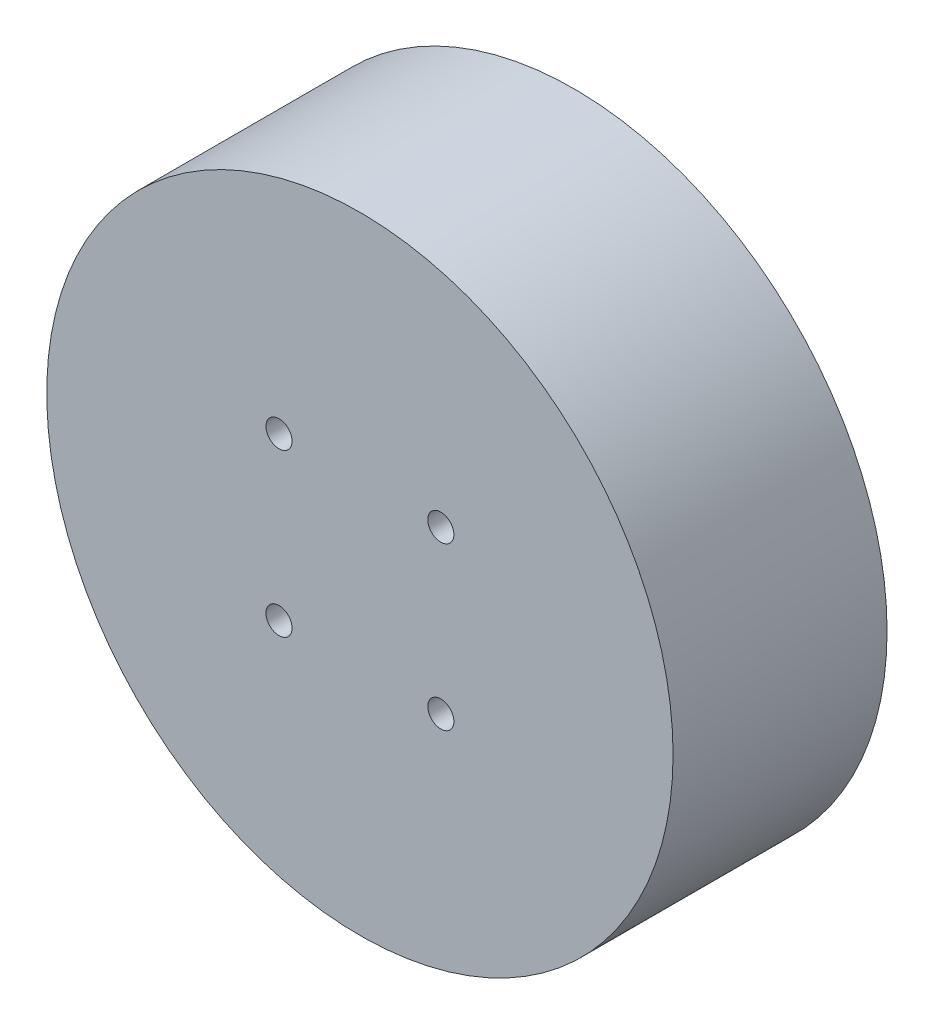
ISO-10303-21;
HEADER;
FILE_DESCRIPTION(('STEP AP214'),'2;1');
FILE_NAME('part.step','',(''),(''),'','','');
FILE_SCHEMA(('AUTOMOTIVE_DESIGN { 1 0 10303 214 1 1 1 1 }'));
ENDSEC;
DATA;
#1=APPLICATION_CONTEXT('core data for automotive mechanical design processes');
#2=APPLICATION_PROTOCOL_DEFINITION('international standard','automotive_design',2000,#1);
#3=PRODUCT_CONTEXT('',#1,'mechanical');
#4=PRODUCT('Part','Part','',(#3));
#5=PRODUCT_RELATED_PRODUCT_CATEGORY('part','',(#4));
#6=PRODUCT_DEFINITION_FORMATION('','',#4);
#7=PRODUCT_DEFINITION_CONTEXT('part definition',#1,'design');
#8=PRODUCT_DEFINITION('design','',#6,#7);
#9=PRODUCT_DEFINITION_SHAPE('','',#8);
#10=(LENGTH_UNIT() NAMED_UNIT(*) SI_UNIT(.MILLI.,.METRE.));
#11=(NAMED_UNIT(*) PLANE_ANGLE_UNIT() SI_UNIT($,.RADIAN.));
#12=(NAMED_UNIT(*) SI_UNIT($,.STERADIAN.) SOLID_ANGLE_UNIT());
#13=UNCERTAINTY_MEASURE_WITH_UNIT(LENGTH_MEASURE(1.E-05),#10,'distance_accuracy_value','');
#14=(GEOMETRIC_REPRESENTATION_CONTEXT(3) GLOBAL_UNCERTAINTY_ASSIGNED_CONTEXT((#13)) GLOBAL_UNIT_ASSIGNED_CONTEXT((#10,
#11,#12)) REPRESENTATION_CONTEXT('',''));
#15=CARTESIAN_POINT('',(0.,0.,0.));
#16=DIRECTION('',(0.,0.,1.));
#17=DIRECTION('',(1.,0.,0.));
#18=AXIS2_PLACEMENT_3D('',#15,#16,#17);
#19=CARTESIAN_POINT('',(0.,0.,20.5));
#20=DIRECTION('',(0.,0.,-1.));
#21=DIRECTION('',(-1.,0.,0.));
#22=AXIS2_PLACEMENT_3D('',#19,#20,#21);
#23=CYLINDRICAL_SURFACE('',#22,60.);
#24=CARTESIAN_POINT('',(0.,0.,20.5));
#25=DIRECTION('',(0.,0.,1.));
#26=DIRECTION('',(1.,0.,0.));
#27=AXIS2_PLACEMENT_3D('',#24,#25,#26);
#28=CIRCLE('',#27,60.);
#29=CARTESIAN_POINT('',(60.,0.,20.5));
#30=VERTEX_POINT('',#29);
#31=EDGE_CURVE('E10',#30,#30,#28,.T.);
#32=ORIENTED_EDGE('',*,*,#31,.F.);
#33=EDGE_LOOP('',(#32));
#34=FACE_BOUND('',#33,.T.);
#35=CARTESIAN_POINT('',(0.,0.,-20.5));
#36=DIRECTION('',(0.,0.,1.));
#37=DIRECTION('',(1.,0.,0.));
#38=AXIS2_PLACEMENT_3D('',#35,#36,#37);
#39=CIRCLE('',#38,60.);
#40=CARTESIAN_POINT('',(60.,0.,-20.5));
#41=VERTEX_POINT('',#40);
#42=EDGE_CURVE('E40',#41,#41,#39,.T.);
#43=ORIENTED_EDGE('',*,*,#42,.T.);
#44=EDGE_LOOP('',(#43));
#45=FACE_BOUND('',#44,.T.);
#46=ADVANCED_FACE('F37',(#34,#45),#23,.T.);
#47=CARTESIAN_POINT('',(0.,0.,20.5));
#48=DIRECTION('',(0.,0.,1.));
#49=DIRECTION('',(1.,0.,0.));
#50=AXIS2_PLACEMENT_3D('',#47,#48,#49);
#51=PLANE('',#50);
#52=CARTESIAN_POINT('',(-15.4999999999997,-15.5,20.5));
#53=DIRECTION('',(0.,0.,1.));
#54=DIRECTION('',(1.,0.,0.));
#55=AXIS2_PLACEMENT_3D('',#52,#53,#54);
#56=CIRCLE('',#55,2.5);
#57=CARTESIAN_POINT('',(-12.9999999999997,-15.5,20.5));
#58=VERTEX_POINT('',#57);
#59=EDGE_CURVE('E58',#58,#58,#56,.T.);
#60=ORIENTED_EDGE('',*,*,#59,.F.);
#61=EDGE_LOOP('',(#60));
#62=FACE_BOUND('',#61,.T.);
#63=CARTESIAN_POINT('',(15.5000000000003,-15.5,20.5));
#64=DIRECTION('',(0.,0.,1.));
#65=DIRECTION('',(1.,0.,0.));
#66=AXIS2_PLACEMENT_3D('',#63,#64,#65);
#67=CIRCLE('',#66,2.5);
#68=CARTESIAN_POINT('',(18.0000000000003,-15.5,20.5));
#69=VERTEX_POINT('',#68);
#70=EDGE_CURVE('E64',#69,#69,#67,.T.);
#71=ORIENTED_EDGE('',*,*,#70,.F.);
#72=EDGE_LOOP('',(#71));
#73=FACE_BOUND('',#72,.T.);
#74=CARTESIAN_POINT('',(15.5,15.5,20.5));
#75=DIRECTION('',(0.,0.,1.));
#76=DIRECTION('',(1.,0.,0.));
#77=AXIS2_PLACEMENT_3D('',#74,#75,#76);
#78=CIRCLE('',#77,2.5);
#79=CARTESIAN_POINT('',(18.,15.5,20.5));
#80=VERTEX_POINT('',#79);
#81=EDGE_CURVE('E52',#80,#80,#78,.T.);
#82=ORIENTED_EDGE('',*,*,#81,.F.);
#83=EDGE_LOOP('',(#82));
#84=FACE_BOUND('',#83,.T.);
#85=CARTESIAN_POINT('',(-15.5,15.5,20.5));
#86=DIRECTION('',(0.,0.,1.));
#87=DIRECTION('',(1.,0.,0.));
#88=AXIS2_PLACEMENT_3D('',#85,#86,#87);
#89=CIRCLE('',#88,2.5);
#90=CARTESIAN_POINT('',(-13.,15.5,20.5));
#91=VERTEX_POINT('',#90);
#92=EDGE_CURVE('E49',#91,#91,#89,.T.);
#93=ORIENTED_EDGE('',*,*,#92,.F.);
#94=EDGE_LOOP('',(#93));
#95=FACE_BOUND('',#94,.T.);
#96=ORIENTED_EDGE('',*,*,#31,.T.);
#97=EDGE_LOOP('',(#96));
#98=FACE_BOUND('',#97,.T.);
#99=ADVANCED_FACE('F75',(#62,#73,#84,#95,#98),#51,.T.);
#100=CARTESIAN_POINT('',(0.,0.,-20.5));
#101=DIRECTION('',(0.,0.,1.));
#102=DIRECTION('',(1.,0.,0.));
#103=AXIS2_PLACEMENT_3D('',#100,#101,#102);
#104=PLANE('',#103);
#105=ORIENTED_EDGE('',*,*,#42,.F.);
#106=EDGE_LOOP('',(#105));
#107=FACE_BOUND('',#106,.T.);
#108=ADVANCED_FACE('F78',(#107),#104,.F.);
#109=CARTESIAN_POINT('',(-15.5,15.5,10.5));
#110=DIRECTION('',(0.,0.,1.));
#111=DIRECTION('',(1.,0.,0.));
#112=AXIS2_PLACEMENT_3D('',#109,#110,#111);
#113=CYLINDRICAL_SURFACE('',#112,2.5);
#114=CARTESIAN_POINT('',(-15.5,15.5,10.5));
#115=DIRECTION('',(0.,0.,1.));
#116=DIRECTION('',(1.,0.,0.));
#117=AXIS2_PLACEMENT_3D('',#114,#115,#116);
#118=CIRCLE('',#117,2.5);
#119=CARTESIAN_POINT('',(-13.,15.5,10.5));
#120=VERTEX_POINT('',#119);
#121=EDGE_CURVE('E47',#120,#120,#118,.T.);
#122=ORIENTED_EDGE('',*,*,#121,.F.);
#123=EDGE_LOOP('',(#122));
#124=FACE_BOUND('',#123,.T.);
#125=ORIENTED_EDGE('',*,*,#92,.T.);
#126=EDGE_LOOP('',(#125));
#127=FACE_BOUND('',#126,.T.);
#128=ADVANCED_FACE('F83',(#124,#127),#113,.F.);
#129=CARTESIAN_POINT('',(-15.5,15.5,10.5));
#130=DIRECTION('',(0.,0.,1.));
#131=DIRECTION('',(1.,0.,0.));
#132=AXIS2_PLACEMENT_3D('',#129,#130,#131);
#133=PLANE('',#132);
#134=ORIENTED_EDGE('',*,*,#121,.T.);
#135=EDGE_LOOP('',(#134));
#136=FACE_BOUND('',#135,.T.);
#137=ADVANCED_FACE('F85',(#136),#133,.T.);
#138=CARTESIAN_POINT('',(15.5,15.5,10.5));
#139=DIRECTION('',(0.,0.,1.));
#140=DIRECTION('',(1.,0.,0.));
#141=AXIS2_PLACEMENT_3D('',#138,#139,#140);
#142=CYLINDRICAL_SURFACE('',#141,2.5);
#143=CARTESIAN_POINT('',(15.5,15.5,10.5));
#144=DIRECTION('',(0.,0.,1.));
#145=DIRECTION('',(1.,0.,0.));
#146=AXIS2_PLACEMENT_3D('',#143,#144,#145);
#147=CIRCLE('',#146,2.5);
#148=CARTESIAN_POINT('',(18.,15.5,10.5));
#149=VERTEX_POINT('',#148);
#150=EDGE_CURVE('E67',#149,#149,#147,.T.);
#151=ORIENTED_EDGE('',*,*,#150,.F.);
#152=EDGE_LOOP('',(#151));
#153=FACE_BOUND('',#152,.T.);
#154=ORIENTED_EDGE('',*,*,#81,.T.);
#155=EDGE_LOOP('',(#154));
#156=FACE_BOUND('',#155,.T.);
#157=ADVANCED_FACE('F73',(#153,#156),#142,.F.);
#158=CARTESIAN_POINT('',(15.5,15.5,10.5));
#159=DIRECTION('',(0.,0.,1.));
#160=DIRECTION('',(1.,0.,0.));
#161=AXIS2_PLACEMENT_3D('',#158,#159,#160);
#162=PLANE('',#161);
#163=ORIENTED_EDGE('',*,*,#150,.T.);
#164=EDGE_LOOP('',(#163));
#165=FACE_BOUND('',#164,.T.);
#166=ADVANCED_FACE('F132',(#165),#162,.T.);
#167=CARTESIAN_POINT('',(15.5000000000003,-15.5,10.5));
#168=DIRECTION('',(0.,0.,1.));
#169=DIRECTION('',(1.,0.,0.));
#170=AXIS2_PLACEMENT_3D('',#167,#168,#169);
#171=CYLINDRICAL_SURFACE('',#170,2.5);
#172=CARTESIAN_POINT('',(15.5000000000003,-15.5,10.5));
#173=DIRECTION('',(0.,0.,1.));
#174=DIRECTION('',(1.,0.,0.));
#175=AXIS2_PLACEMENT_3D('',#172,#173,#174);
#176=CIRCLE('',#175,2.5);
#177=CARTESIAN_POINT('',(18.0000000000003,-15.5,10.5));
#178=VERTEX_POINT('',#177);
#179=EDGE_CURVE('E61',#178,#178,#176,.T.);
#180=ORIENTED_EDGE('',*,*,#179,.F.);
#181=EDGE_LOOP('',(#180));
#182=FACE_BOUND('',#181,.T.);
#183=ORIENTED_EDGE('',*,*,#70,.T.);
#184=EDGE_LOOP('',(#183));
#185=FACE_BOUND('',#184,.T.);
#186=ADVANCED_FACE('F141',(#182,#185),#171,.F.);
#187=CARTESIAN_POINT('',(15.5000000000003,-15.5,10.5));
#188=DIRECTION('',(0.,0.,1.));
#189=DIRECTION('',(1.,0.,0.));
#190=AXIS2_PLACEMENT_3D('',#187,#188,#189);
#191=PLANE('',#190);
#192=ORIENTED_EDGE('',*,*,#179,.T.);
#193=EDGE_LOOP('',(#192));
#194=FACE_BOUND('',#193,.T.);
#195=ADVANCED_FACE('F150',(#194),#191,.T.);
#196=CARTESIAN_POINT('',(-15.4999999999997,-15.5,10.5));
#197=DIRECTION('',(0.,0.,1.));
#198=DIRECTION('',(1.,0.,0.));
#199=AXIS2_PLACEMENT_3D('',#196,#197,#198);
#200=CYLINDRICAL_SURFACE('',#199,2.5);
#201=CARTESIAN_POINT('',(-15.4999999999997,-15.5,10.5));
#202=DIRECTION('',(0.,0.,1.));
#203=DIRECTION('',(1.,0.,0.));
#204=AXIS2_PLACEMENT_3D('',#201,#202,#203);
#205=CIRCLE('',#204,2.5);
#206=CARTESIAN_POINT('',(-12.9999999999997,-15.5,10.5));
#207=VERTEX_POINT('',#206);
#208=EDGE_CURVE('E55',#207,#207,#205,.T.);
#209=ORIENTED_EDGE('',*,*,#208,.F.);
#210=EDGE_LOOP('',(#209));
#211=FACE_BOUND('',#210,.T.);
#212=ORIENTED_EDGE('',*,*,#59,.T.);
#213=EDGE_LOOP('',(#212));
#214=FACE_BOUND('',#213,.T.);
#215=ADVANCED_FACE('F159',(#211,#214),#200,.F.);
#216=CARTESIAN_POINT('',(-15.4999999999997,-15.5,10.5));
#217=DIRECTION('',(0.,0.,1.));
#218=DIRECTION('',(1.,0.,0.));
#219=AXIS2_PLACEMENT_3D('',#216,#217,#218);
#220=PLANE('',#219);
#221=ORIENTED_EDGE('',*,*,#208,.T.);
#222=EDGE_LOOP('',(#221));
#223=FACE_BOUND('',#222,.T.);
#224=ADVANCED_FACE('F168',(#223),#220,.T.);
#225=CLOSED_SHELL('',(#46,#99,#108,#128,#137,#157,#166,#186,#195,#215,#224));
#226=MANIFOLD_SOLID_BREP('B2',#225);
#227=ADVANCED_BREP_SHAPE_REPRESENTATION('',(#18,#226),#14);
#228=SHAPE_DEFINITION_REPRESENTATION(#9,#227);
ENDSEC;
END-ISO-10303-21;
